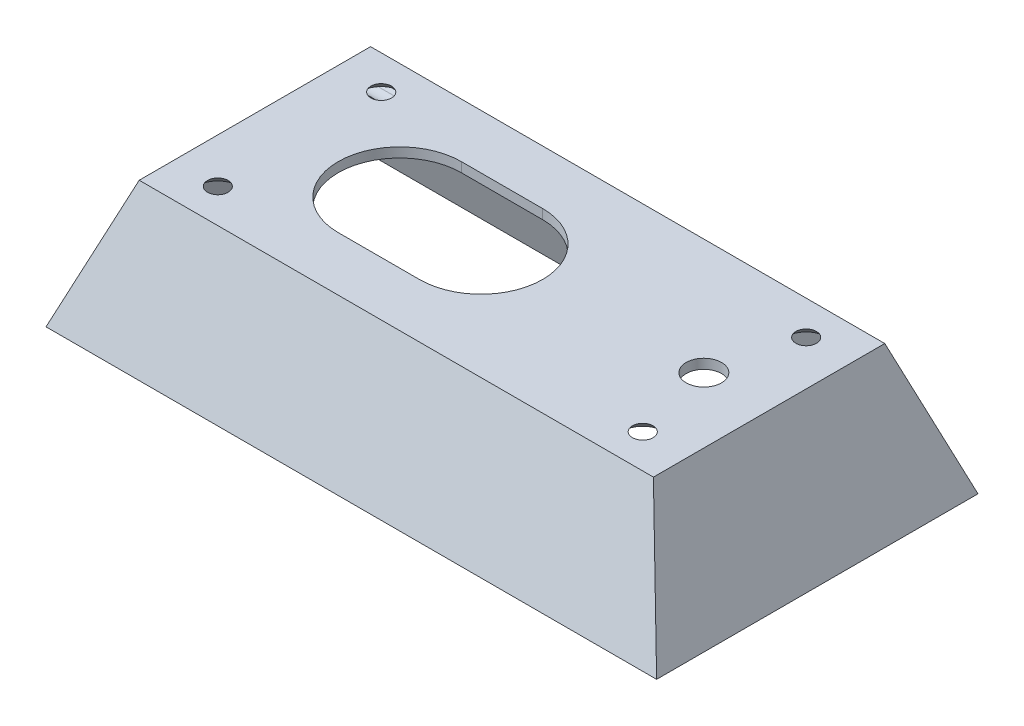
ISO-10303-21;
HEADER;
FILE_DESCRIPTION(('STEP AP214'),'2;1');
FILE_NAME('part.step','',(''),(''),'','','');
FILE_SCHEMA(('AUTOMOTIVE_DESIGN { 1 0 10303 214 1 1 1 1 }'));
ENDSEC;
DATA;
#1=APPLICATION_CONTEXT('core data for automotive mechanical design processes');
#2=APPLICATION_PROTOCOL_DEFINITION('international standard','automotive_design',2000,#1);
#3=PRODUCT_CONTEXT('',#1,'mechanical');
#4=PRODUCT('Part','Part','',(#3));
#5=PRODUCT_RELATED_PRODUCT_CATEGORY('part','',(#4));
#6=PRODUCT_DEFINITION_FORMATION('','',#4);
#7=PRODUCT_DEFINITION_CONTEXT('part definition',#1,'design');
#8=PRODUCT_DEFINITION('design','',#6,#7);
#9=PRODUCT_DEFINITION_SHAPE('','',#8);
#10=(LENGTH_UNIT() NAMED_UNIT(*) SI_UNIT(.MILLI.,.METRE.));
#11=(NAMED_UNIT(*) PLANE_ANGLE_UNIT() SI_UNIT($,.RADIAN.));
#12=(NAMED_UNIT(*) SI_UNIT($,.STERADIAN.) SOLID_ANGLE_UNIT());
#13=UNCERTAINTY_MEASURE_WITH_UNIT(LENGTH_MEASURE(1.E-05),#10,'distance_accuracy_value','');
#14=(GEOMETRIC_REPRESENTATION_CONTEXT(3) GLOBAL_UNCERTAINTY_ASSIGNED_CONTEXT((#13)) GLOBAL_UNIT_ASSIGNED_CONTEXT((#10,
#11,#12)) REPRESENTATION_CONTEXT('',''));
#15=CARTESIAN_POINT('',(0.,0.,0.));
#16=DIRECTION('',(0.,0.,1.));
#17=DIRECTION('',(1.,0.,0.));
#18=AXIS2_PLACEMENT_3D('',#15,#16,#17);
#19=CARTESIAN_POINT('',(0.,7.29957458562499,20.8559273875));
#20=DIRECTION('',(0.,0.330350424728106,0.943858356366017));
#21=DIRECTION('',(0.,-0.943858356366017,0.330350424728106));
#22=AXIS2_PLACEMENT_3D('',#19,#20,#21);
#23=PLANE('',#22);
#24=DIRECTION('',(1.,0.,0.));
#25=VECTOR('',#24,1.);
#26=CARTESIAN_POINT('',(-39.7391824417549,16.4235116159948,17.6625494268706));
#27=LINE('',#26,#25);
#28=CARTESIAN_POINT('',(-39.7391824417549,16.4235116159948,17.6625494268706));
#29=VERTEX_POINT('',#28);
#30=CARTESIAN_POINT('',(7.60528037208097,16.4235116159948,17.6625494268706));
#31=VERTEX_POINT('',#30);
#32=EDGE_CURVE('E203',#29,#31,#27,.T.);
#33=ORIENTED_EDGE('',*,*,#32,.F.);
#34=DIRECTION('',(-0.333663039975097,-0.889768106600258,0.311418837310091));
#35=VECTOR('',#34,1.);
#36=CARTESIAN_POINT('',(-38.3555384736991,20.1132288641436,16.3711483900184));
#37=LINE('',#36,#35);
#38=CARTESIAN_POINT('',(-38.960499297753,18.5,16.9357784924687));
#39=VERTEX_POINT('',#38);
#40=EDGE_CURVE('E224',#39,#29,#37,.T.);
#41=ORIENTED_EDGE('',*,*,#40,.F.);
#42=DIRECTION('',(1.,0.,0.));
#43=VECTOR('',#42,1.);
#44=CARTESIAN_POINT('',(0.,18.5,16.9357784924687));
#45=LINE('',#44,#43);
#46=CARTESIAN_POINT('',(38.960499297753,18.5,16.9357784924687));
#47=VERTEX_POINT('',#46);
#48=EDGE_CURVE('E241',#39,#47,#45,.T.);
#49=ORIENTED_EDGE('',*,*,#48,.T.);
#50=DIRECTION('',(0.333663039975097,-0.889768106600258,0.311418837310091));
#51=VECTOR('',#50,1.);
#52=CARTESIAN_POINT('',(38.3555384736991,20.1132288641436,16.3711483900184));
#53=LINE('',#52,#51);
#54=CARTESIAN_POINT('',(45.897999297753,0.,23.4107784924687));
#55=VERTEX_POINT('',#54);
#56=EDGE_CURVE('E234',#47,#55,#53,.T.);
#57=ORIENTED_EDGE('',*,*,#56,.T.);
#58=DIRECTION('',(1.,0.,0.));
#59=VECTOR('',#58,1.);
#60=CARTESIAN_POINT('',(0.,0.,23.4107784924687));
#61=LINE('',#60,#59);
#62=CARTESIAN_POINT('',(-45.897999297753,0.,23.4107784924687));
#63=VERTEX_POINT('',#62);
#64=EDGE_CURVE('E251',#63,#55,#61,.T.);
#65=ORIENTED_EDGE('',*,*,#64,.F.);
#66=CARTESIAN_POINT('',(-40.4470762090294,14.5357949032627,18.3232502763268));
#67=VERTEX_POINT('',#66);
#68=EDGE_CURVE('E235',#67,#63,#37,.T.);
#69=ORIENTED_EDGE('',*,*,#68,.F.);
#70=DIRECTION('',(-1.,0.,0.));
#71=VECTOR('',#70,1.);
#72=CARTESIAN_POINT('',(-40.4470762090294,14.5357949032627,18.3232502763268));
#73=LINE('',#72,#71);
#74=CARTESIAN_POINT('',(7.60528037208097,14.5357949032627,18.3232502763268));
#75=VERTEX_POINT('',#74);
#76=EDGE_CURVE('E567',#75,#67,#73,.T.);
#77=ORIENTED_EDGE('',*,*,#76,.F.);
#78=DIRECTION('',(0.,-0.943858356366017,0.330350424728107));
#79=VECTOR('',#78,1.);
#80=CARTESIAN_POINT('',(7.60528037208097,16.4235116159948,17.6625494268706));
#81=LINE('',#80,#79);
#82=EDGE_CURVE('E227',#31,#75,#81,.T.);
#83=ORIENTED_EDGE('',*,*,#82,.F.);
#84=EDGE_LOOP('',(#33,#41,#49,#57,#65,#69,#77,#83));
#85=FACE_BOUND('',#84,.T.);
#86=ADVANCED_FACE('F51',(#85),#23,.F.);
#87=CARTESIAN_POINT('',(0.,0.,0.));
#88=DIRECTION('',(0.,1.,0.));
#89=DIRECTION('',(0.,0.,1.));
#90=AXIS2_PLACEMENT_3D('',#87,#88,#89);
#91=PLANE('',#90);
#92=ORIENTED_EDGE('',*,*,#64,.T.);
#93=DIRECTION('',(0.,0.,-1.));
#94=VECTOR('',#93,1.);
#95=CARTESIAN_POINT('',(45.897999297753,0.,0.));
#96=LINE('',#95,#94);
#97=CARTESIAN_POINT('',(45.897999297753,0.,-23.4107784924687));
#98=VERTEX_POINT('',#97);
#99=EDGE_CURVE('E247',#55,#98,#96,.T.);
#100=ORIENTED_EDGE('',*,*,#99,.T.);
#101=DIRECTION('',(-1.,0.,0.));
#102=VECTOR('',#101,1.);
#103=CARTESIAN_POINT('',(0.,0.,-23.4107784924687));
#104=LINE('',#103,#102);
#105=CARTESIAN_POINT('',(-45.897999297753,0.,-23.4107784924687));
#106=VERTEX_POINT('',#105);
#107=EDGE_CURVE('E257',#98,#106,#104,.T.);
#108=ORIENTED_EDGE('',*,*,#107,.T.);
#109=DIRECTION('',(0.,0.,1.));
#110=VECTOR('',#109,1.);
#111=CARTESIAN_POINT('',(-45.897999297753,0.,0.));
#112=LINE('',#111,#110);
#113=EDGE_CURVE('E254',#106,#63,#112,.T.);
#114=ORIENTED_EDGE('',*,*,#113,.T.);
#115=EDGE_LOOP('',(#92,#100,#108,#114));
#116=FACE_BOUND('',#115,.T.);
#117=DIRECTION('',(0.,0.,-1.));
#118=VECTOR('',#117,1.);
#119=CARTESIAN_POINT('',(47.5,0.,-25.));
#120=LINE('',#119,#118);
#121=CARTESIAN_POINT('',(47.5,0.,25.));
#122=VERTEX_POINT('',#121);
#123=CARTESIAN_POINT('',(47.5,0.,-25.));
#124=VERTEX_POINT('',#123);
#125=EDGE_CURVE('E311',#122,#124,#120,.T.);
#126=ORIENTED_EDGE('',*,*,#125,.F.);
#127=DIRECTION('',(1.,0.,0.));
#128=VECTOR('',#127,1.);
#129=CARTESIAN_POINT('',(-47.5,0.,25.));
#130=LINE('',#129,#128);
#131=CARTESIAN_POINT('',(-47.5,0.,25.));
#132=VERTEX_POINT('',#131);
#133=EDGE_CURVE('E383',#132,#122,#130,.T.);
#134=ORIENTED_EDGE('',*,*,#133,.F.);
#135=DIRECTION('',(0.,0.,1.));
#136=VECTOR('',#135,1.);
#137=CARTESIAN_POINT('',(-47.5,0.,-25.));
#138=LINE('',#137,#136);
#139=CARTESIAN_POINT('',(-47.5,0.,-25.));
#140=VERTEX_POINT('',#139);
#141=EDGE_CURVE('E385',#140,#132,#138,.T.);
#142=ORIENTED_EDGE('',*,*,#141,.F.);
#143=DIRECTION('',(-1.,0.,0.));
#144=VECTOR('',#143,1.);
#145=CARTESIAN_POINT('',(-47.5,0.,-25.));
#146=LINE('',#145,#144);
#147=EDGE_CURVE('E378',#124,#140,#146,.T.);
#148=ORIENTED_EDGE('',*,*,#147,.F.);
#149=EDGE_LOOP('',(#126,#134,#142,#148));
#150=FACE_BOUND('',#149,.T.);
#151=ADVANCED_FACE('F290',(#116,#150),#91,.F.);
#152=CARTESIAN_POINT('',(0.,20.,0.));
#153=DIRECTION('',(0.,1.,0.));
#154=DIRECTION('',(0.,0.,1.));
#155=AXIS2_PLACEMENT_3D('',#152,#153,#154);
#156=PLANE('',#155);
#157=CARTESIAN_POINT('',(33.0576726488888,20.,-12.7118055800183));
#158=DIRECTION('',(0.,1.,0.));
#159=DIRECTION('',(0.,0.,1.));
#160=AXIS2_PLACEMENT_3D('',#157,#158,#159);
#161=CIRCLE('',#160,1.60355303137907);
#162=CARTESIAN_POINT('',(33.0576726488888,20.,-11.1082525486392));
#163=VERTEX_POINT('',#162);
#164=EDGE_CURVE('E12',#163,#163,#161,.F.);
#165=ORIENTED_EDGE('',*,*,#164,.T.);
#166=EDGE_LOOP('',(#165));
#167=FACE_BOUND('',#166,.T.);
#168=CARTESIAN_POINT('',(-33.0576726488888,20.,-12.7118055800183));
#169=DIRECTION('',(0.,1.,0.));
#170=DIRECTION('',(0.,0.,1.));
#171=AXIS2_PLACEMENT_3D('',#168,#169,#170);
#172=CIRCLE('',#171,1.60355303137907);
#173=CARTESIAN_POINT('',(-33.0576726488888,20.,-11.1082525486392));
#174=VERTEX_POINT('',#173);
#175=EDGE_CURVE('E60',#174,#174,#172,.F.);
#176=ORIENTED_EDGE('',*,*,#175,.T.);
#177=EDGE_LOOP('',(#176));
#178=FACE_BOUND('',#177,.T.);
#179=CARTESIAN_POINT('',(33.0576726488888,20.,12.7118055800183));
#180=DIRECTION('',(0.,1.,0.));
#181=DIRECTION('',(0.,0.,1.));
#182=AXIS2_PLACEMENT_3D('',#179,#180,#181);
#183=CIRCLE('',#182,1.60355303137907);
#184=CARTESIAN_POINT('',(33.0576726488888,20.,14.3153586113973));
#185=VERTEX_POINT('',#184);
#186=EDGE_CURVE('E484',#185,#185,#183,.F.);
#187=ORIENTED_EDGE('',*,*,#186,.T.);
#188=EDGE_LOOP('',(#187));
#189=FACE_BOUND('',#188,.T.);
#190=CARTESIAN_POINT('',(-33.0576726488888,20.,12.7118055800183));
#191=DIRECTION('',(0.,1.,0.));
#192=DIRECTION('',(0.,0.,1.));
#193=AXIS2_PLACEMENT_3D('',#190,#191,#192);
#194=CIRCLE('',#193,1.60355303137907);
#195=CARTESIAN_POINT('',(-33.0576726488888,20.,14.3153586113973));
#196=VERTEX_POINT('',#195);
#197=EDGE_CURVE('E481',#196,#196,#194,.F.);
#198=ORIENTED_EDGE('',*,*,#197,.T.);
#199=EDGE_LOOP('',(#198));
#200=FACE_BOUND('',#199,.T.);
#201=CARTESIAN_POINT('',(29.8501847985942,20.,0.));
#202=DIRECTION('',(0.,1.,0.));
#203=DIRECTION('',(0.,0.,1.));
#204=AXIS2_PLACEMENT_3D('',#201,#202,#203);
#205=CIRCLE('',#204,2.75);
#206=CARTESIAN_POINT('',(29.8501847985942,20.,2.75));
#207=VERTEX_POINT('',#206);
#208=EDGE_CURVE('E469',#207,#207,#205,.T.);
#209=ORIENTED_EDGE('',*,*,#208,.F.);
#210=EDGE_LOOP('',(#209));
#211=FACE_BOUND('',#210,.T.);
#212=CARTESIAN_POINT('',(-17.4597803829499,20.,0.));
#213=DIRECTION('',(0.,1.,0.));
#214=DIRECTION('',(0.,0.,1.));
#215=AXIS2_PLACEMENT_3D('',#212,#213,#214);
#216=CIRCLE('',#215,9.57262281789639);
#217=CARTESIAN_POINT('',(-17.4597803829499,20.,-9.57262281789639));
#218=VERTEX_POINT('',#217);
#219=CARTESIAN_POINT('',(-17.4597803829499,20.,9.57262281789639));
#220=VERTEX_POINT('',#219);
#221=EDGE_CURVE('E542',#218,#220,#216,.T.);
#222=ORIENTED_EDGE('',*,*,#221,.F.);
#223=DIRECTION('',(-1.,0.,0.));
#224=VECTOR('',#223,1.);
#225=CARTESIAN_POINT('',(-17.4597803829499,20.,-9.57262281789639));
#226=LINE('',#225,#224);
#227=CARTESIAN_POINT('',(-4.81483557911311,20.,-9.57262281789639));
#228=VERTEX_POINT('',#227);
#229=EDGE_CURVE('E529',#228,#218,#226,.T.);
#230=ORIENTED_EDGE('',*,*,#229,.F.);
#231=CARTESIAN_POINT('',(-4.81483557911311,20.,0.));
#232=DIRECTION('',(0.,1.,0.));
#233=DIRECTION('',(0.,0.,1.));
#234=AXIS2_PLACEMENT_3D('',#231,#232,#233);
#235=CIRCLE('',#234,9.57262281789639);
#236=CARTESIAN_POINT('',(-4.81483557911311,20.,9.57262281789639));
#237=VERTEX_POINT('',#236);
#238=EDGE_CURVE('E536',#237,#228,#235,.T.);
#239=ORIENTED_EDGE('',*,*,#238,.F.);
#240=DIRECTION('',(1.,0.,0.));
#241=VECTOR('',#240,1.);
#242=CARTESIAN_POINT('',(-17.4597803829499,20.,9.57262281789639));
#243=LINE('',#242,#241);
#244=EDGE_CURVE('E539',#220,#237,#243,.T.);
#245=ORIENTED_EDGE('',*,*,#244,.F.);
#246=EDGE_LOOP('',(#222,#230,#239,#245));
#247=FACE_BOUND('',#246,.T.);
#248=DIRECTION('',(0.,0.,-1.));
#249=VECTOR('',#248,1.);
#250=CARTESIAN_POINT('',(40.,20.,-18.));
#251=LINE('',#250,#249);
#252=CARTESIAN_POINT('',(40.,20.,18.));
#253=VERTEX_POINT('',#252);
#254=CARTESIAN_POINT('',(40.,20.,-18.));
#255=VERTEX_POINT('',#254);
#256=EDGE_CURVE('E260',#253,#255,#251,.T.);
#257=ORIENTED_EDGE('',*,*,#256,.T.);
#258=DIRECTION('',(-1.,0.,0.));
#259=VECTOR('',#258,1.);
#260=CARTESIAN_POINT('',(-40.,20.,-18.));
#261=LINE('',#260,#259);
#262=CARTESIAN_POINT('',(-40.,20.,-18.));
#263=VERTEX_POINT('',#262);
#264=EDGE_CURVE('E268',#255,#263,#261,.T.);
#265=ORIENTED_EDGE('',*,*,#264,.T.);
#266=DIRECTION('',(0.,0.,1.));
#267=VECTOR('',#266,1.);
#268=CARTESIAN_POINT('',(-40.,20.,-18.));
#269=LINE('',#268,#267);
#270=CARTESIAN_POINT('',(-40.,20.,18.));
#271=VERTEX_POINT('',#270);
#272=EDGE_CURVE('E367',#263,#271,#269,.T.);
#273=ORIENTED_EDGE('',*,*,#272,.T.);
#274=DIRECTION('',(1.,0.,0.));
#275=VECTOR('',#274,1.);
#276=CARTESIAN_POINT('',(-40.,20.,18.));
#277=LINE('',#276,#275);
#278=EDGE_CURVE('E352',#271,#253,#277,.T.);
#279=ORIENTED_EDGE('',*,*,#278,.T.);
#280=EDGE_LOOP('',(#257,#265,#273,#279));
#281=FACE_BOUND('',#280,.T.);
#282=ADVANCED_FACE('F489',(#167,#178,#189,#200,#211,#247,#281),#156,.T.);
#283=CARTESIAN_POINT('',(0.,7.79510022271715,22.271714922049));
#284=DIRECTION('',(0.,0.330350424728106,0.943858356366017));
#285=DIRECTION('',(0.,-0.943858356366017,0.330350424728106));
#286=AXIS2_PLACEMENT_3D('',#283,#284,#285);
#287=PLANE('',#286);
#288=DIRECTION('',(-0.333663039975097,-0.889768106600258,0.311418837310091));
#289=VECTOR('',#288,1.);
#290=CARTESIAN_POINT('',(-40.,20.,18.));
#291=LINE('',#290,#289);
#292=EDGE_CURVE('E344',#271,#132,#291,.T.);
#293=ORIENTED_EDGE('',*,*,#292,.T.);
#294=ORIENTED_EDGE('',*,*,#133,.T.);
#295=DIRECTION('',(0.333663039975097,-0.889768106600258,0.311418837310091));
#296=VECTOR('',#295,1.);
#297=CARTESIAN_POINT('',(40.,20.,18.));
#298=LINE('',#297,#296);
#299=EDGE_CURVE('E336',#253,#122,#298,.T.);
#300=ORIENTED_EDGE('',*,*,#299,.F.);
#301=ORIENTED_EDGE('',*,*,#278,.F.);
#302=EDGE_LOOP('',(#293,#294,#300,#301));
#303=FACE_BOUND('',#302,.T.);
#304=ADVANCED_FACE('F325',(#303),#287,.T.);
#305=CARTESIAN_POINT('',(41.6438356164384,15.6164383561644,0.));
#306=DIRECTION('',(0.936329177569045,0.351123441588392,0.));
#307=DIRECTION('',(-0.351123441588392,0.936329177569045,0.));
#308=AXIS2_PLACEMENT_3D('',#305,#306,#307);
#309=PLANE('',#308);
#310=ORIENTED_EDGE('',*,*,#299,.T.);
#311=ORIENTED_EDGE('',*,*,#125,.T.);
#312=DIRECTION('',(0.333663039975097,-0.889768106600258,-0.31141883731009));
#313=VECTOR('',#312,1.);
#314=CARTESIAN_POINT('',(40.,20.,-18.));
#315=LINE('',#314,#313);
#316=EDGE_CURVE('E274',#255,#124,#315,.T.);
#317=ORIENTED_EDGE('',*,*,#316,.F.);
#318=ORIENTED_EDGE('',*,*,#256,.F.);
#319=EDGE_LOOP('',(#310,#311,#317,#318));
#320=FACE_BOUND('',#319,.T.);
#321=ADVANCED_FACE('F316',(#320),#309,.T.);
#322=CARTESIAN_POINT('',(-41.6438356164384,15.6164383561644,0.));
#323=DIRECTION('',(-0.936329177569045,0.351123441588392,0.));
#324=DIRECTION('',(-0.351123441588392,-0.936329177569045,0.));
#325=AXIS2_PLACEMENT_3D('',#322,#323,#324);
#326=PLANE('',#325);
#327=DIRECTION('',(-0.333663039975097,-0.889768106600258,-0.31141883731009));
#328=VECTOR('',#327,1.);
#329=CARTESIAN_POINT('',(-40.,20.,-18.));
#330=LINE('',#329,#328);
#331=EDGE_CURVE('E343',#263,#140,#330,.T.);
#332=ORIENTED_EDGE('',*,*,#331,.T.);
#333=ORIENTED_EDGE('',*,*,#141,.T.);
#334=ORIENTED_EDGE('',*,*,#292,.F.);
#335=ORIENTED_EDGE('',*,*,#272,.F.);
#336=EDGE_LOOP('',(#332,#333,#334,#335));
#337=FACE_BOUND('',#336,.T.);
#338=ADVANCED_FACE('F287',(#337),#326,.T.);
#339=CARTESIAN_POINT('',(0.,7.79510022271715,-22.271714922049));
#340=DIRECTION('',(0.,0.330350424728106,-0.943858356366018));
#341=DIRECTION('',(0.,0.943858356366018,0.330350424728106));
#342=AXIS2_PLACEMENT_3D('',#339,#340,#341);
#343=PLANE('',#342);
#344=ORIENTED_EDGE('',*,*,#316,.T.);
#345=ORIENTED_EDGE('',*,*,#147,.T.);
#346=ORIENTED_EDGE('',*,*,#331,.F.);
#347=ORIENTED_EDGE('',*,*,#264,.F.);
#348=EDGE_LOOP('',(#344,#345,#346,#347));
#349=FACE_BOUND('',#348,.T.);
#350=ADVANCED_FACE('F276',(#349),#343,.T.);
#351=CARTESIAN_POINT('',(0.,18.5,0.));
#352=DIRECTION('',(0.,1.,0.));
#353=DIRECTION('',(0.,0.,1.));
#354=AXIS2_PLACEMENT_3D('',#351,#352,#353);
#355=PLANE('',#354);
#356=CARTESIAN_POINT('',(33.0576726488888,18.5,-12.7118055800183));
#357=DIRECTION('',(0.,1.,0.));
#358=DIRECTION('',(0.,0.,1.));
#359=AXIS2_PLACEMENT_3D('',#356,#357,#358);
#360=CIRCLE('',#359,3.15684850206494);
#361=CARTESIAN_POINT('',(33.0576726488888,18.5,-9.55495707795333));
#362=VERTEX_POINT('',#361);
#363=EDGE_CURVE('E478',#362,#362,#360,.T.);
#364=ORIENTED_EDGE('',*,*,#363,.T.);
#365=EDGE_LOOP('',(#364));
#366=FACE_BOUND('',#365,.T.);
#367=CARTESIAN_POINT('',(-33.0576726488888,18.5,-12.7118055800183));
#368=DIRECTION('',(0.,1.,0.));
#369=DIRECTION('',(0.,0.,1.));
#370=AXIS2_PLACEMENT_3D('',#367,#368,#369);
#371=CIRCLE('',#370,3.15684850206494);
#372=CARTESIAN_POINT('',(-33.0576726488888,18.5,-9.55495707795333));
#373=VERTEX_POINT('',#372);
#374=EDGE_CURVE('E475',#373,#373,#371,.T.);
#375=ORIENTED_EDGE('',*,*,#374,.T.);
#376=EDGE_LOOP('',(#375));
#377=FACE_BOUND('',#376,.T.);
#378=CARTESIAN_POINT('',(33.0576726488888,18.5,12.7118055800183));
#379=DIRECTION('',(0.,1.,0.));
#380=DIRECTION('',(0.,0.,1.));
#381=AXIS2_PLACEMENT_3D('',#378,#379,#380);
#382=CIRCLE('',#381,3.15684850206494);
#383=CARTESIAN_POINT('',(33.0576726488888,18.5,15.8686540820832));
#384=VERTEX_POINT('',#383);
#385=EDGE_CURVE('E472',#384,#384,#382,.T.);
#386=ORIENTED_EDGE('',*,*,#385,.T.);
#387=EDGE_LOOP('',(#386));
#388=FACE_BOUND('',#387,.T.);
#389=CARTESIAN_POINT('',(-33.0576726488888,18.5,12.7118055800183));
#390=DIRECTION('',(0.,1.,0.));
#391=DIRECTION('',(0.,0.,1.));
#392=AXIS2_PLACEMENT_3D('',#389,#390,#391);
#393=CIRCLE('',#392,3.15684850206494);
#394=CARTESIAN_POINT('',(-33.0576726488888,18.5,15.8686540820832));
#395=VERTEX_POINT('',#394);
#396=EDGE_CURVE('E463',#395,#395,#393,.T.);
#397=ORIENTED_EDGE('',*,*,#396,.T.);
#398=EDGE_LOOP('',(#397));
#399=FACE_BOUND('',#398,.T.);
#400=CARTESIAN_POINT('',(29.8501847985942,18.5,0.));
#401=DIRECTION('',(0.,1.,0.));
#402=DIRECTION('',(0.,0.,1.));
#403=AXIS2_PLACEMENT_3D('',#400,#401,#402);
#404=CIRCLE('',#403,2.75);
#405=CARTESIAN_POINT('',(29.8501847985942,18.5,2.75));
#406=VERTEX_POINT('',#405);
#407=EDGE_CURVE('E466',#406,#406,#404,.T.);
#408=ORIENTED_EDGE('',*,*,#407,.T.);
#409=EDGE_LOOP('',(#408));
#410=FACE_BOUND('',#409,.T.);
#411=DIRECTION('',(-1.,0.,0.));
#412=VECTOR('',#411,1.);
#413=CARTESIAN_POINT('',(0.,18.5,-9.57262281789639));
#414=LINE('',#413,#412);
#415=CARTESIAN_POINT('',(-4.81483557911311,18.5,-9.57262281789639));
#416=VERTEX_POINT('',#415);
#417=CARTESIAN_POINT('',(-17.4597803829499,18.5,-9.57262281789639));
#418=VERTEX_POINT('',#417);
#419=EDGE_CURVE('E431',#416,#418,#414,.T.);
#420=ORIENTED_EDGE('',*,*,#419,.T.);
#421=CARTESIAN_POINT('',(-17.4597803829499,18.5,0.));
#422=DIRECTION('',(0.,1.,0.));
#423=DIRECTION('',(0.,0.,1.));
#424=AXIS2_PLACEMENT_3D('',#421,#422,#423);
#425=CIRCLE('',#424,9.57262281789639);
#426=CARTESIAN_POINT('',(-17.4597803829499,18.5,9.57262281789639));
#427=VERTEX_POINT('',#426);
#428=EDGE_CURVE('E434',#418,#427,#425,.T.);
#429=ORIENTED_EDGE('',*,*,#428,.T.);
#430=DIRECTION('',(1.,0.,0.));
#431=VECTOR('',#430,1.);
#432=CARTESIAN_POINT('',(0.,18.5,9.57262281789639));
#433=LINE('',#432,#431);
#434=CARTESIAN_POINT('',(-4.81483557911311,18.5,9.57262281789639));
#435=VERTEX_POINT('',#434);
#436=EDGE_CURVE('E396',#427,#435,#433,.T.);
#437=ORIENTED_EDGE('',*,*,#436,.T.);
#438=CARTESIAN_POINT('',(-4.81483557911311,18.5,0.));
#439=DIRECTION('',(0.,1.,0.));
#440=DIRECTION('',(0.,0.,1.));
#441=AXIS2_PLACEMENT_3D('',#438,#439,#440);
#442=CIRCLE('',#441,9.57262281789639);
#443=EDGE_CURVE('E428',#435,#416,#442,.T.);
#444=ORIENTED_EDGE('',*,*,#443,.T.);
#445=EDGE_LOOP('',(#420,#429,#437,#444));
#446=FACE_BOUND('',#445,.T.);
#447=DIRECTION('',(0.,0.,-1.));
#448=VECTOR('',#447,1.);
#449=CARTESIAN_POINT('',(38.960499297753,18.5,0.));
#450=LINE('',#449,#448);
#451=CARTESIAN_POINT('',(38.960499297753,18.5,-16.9357784924687));
#452=VERTEX_POINT('',#451);
#453=EDGE_CURVE('E515',#47,#452,#450,.T.);
#454=ORIENTED_EDGE('',*,*,#453,.F.);
#455=ORIENTED_EDGE('',*,*,#48,.F.);
#456=DIRECTION('',(0.,0.,1.));
#457=VECTOR('',#456,1.);
#458=CARTESIAN_POINT('',(-38.960499297753,18.5,0.));
#459=LINE('',#458,#457);
#460=CARTESIAN_POINT('',(-38.960499297753,18.5,-16.9357784924687));
#461=VERTEX_POINT('',#460);
#462=EDGE_CURVE('E232',#461,#39,#459,.T.);
#463=ORIENTED_EDGE('',*,*,#462,.F.);
#464=DIRECTION('',(-1.,0.,0.));
#465=VECTOR('',#464,1.);
#466=CARTESIAN_POINT('',(0.,18.5,-16.9357784924687));
#467=LINE('',#466,#465);
#468=EDGE_CURVE('E239',#452,#461,#467,.T.);
#469=ORIENTED_EDGE('',*,*,#468,.F.);
#470=EDGE_LOOP('',(#454,#455,#463,#469));
#471=FACE_BOUND('',#470,.T.);
#472=ADVANCED_FACE('F286',(#366,#377,#388,#399,#410,#446,#471),#355,.F.);
#473=CARTESIAN_POINT('',(40.2393418500848,15.0897531937818,0.));
#474=DIRECTION('',(0.936329177569045,0.351123441588392,0.));
#475=DIRECTION('',(-0.351123441588392,0.936329177569045,0.));
#476=AXIS2_PLACEMENT_3D('',#473,#474,#475);
#477=PLANE('',#476);
#478=ORIENTED_EDGE('',*,*,#56,.F.);
#479=ORIENTED_EDGE('',*,*,#453,.T.);
#480=DIRECTION('',(0.333663039975097,-0.889768106600258,-0.31141883731009));
#481=VECTOR('',#480,1.);
#482=CARTESIAN_POINT('',(38.3555384736991,20.1132288641436,-16.3711483900185));
#483=LINE('',#482,#481);
#484=EDGE_CURVE('E244',#452,#98,#483,.T.);
#485=ORIENTED_EDGE('',*,*,#484,.T.);
#486=ORIENTED_EDGE('',*,*,#99,.F.);
#487=EDGE_LOOP('',(#478,#479,#485,#486));
#488=FACE_BOUND('',#487,.T.);
#489=ADVANCED_FACE('F502',(#488),#477,.F.);
#490=CARTESIAN_POINT('',(-40.2393418500848,15.0897531937818,0.));
#491=DIRECTION('',(-0.936329177569045,0.351123441588392,0.));
#492=DIRECTION('',(-0.351123441588392,-0.936329177569045,0.));
#493=AXIS2_PLACEMENT_3D('',#490,#491,#492);
#494=PLANE('',#493);
#495=DIRECTION('',(-0.333663039975097,-0.889768106600258,-0.31141883731009));
#496=VECTOR('',#495,1.);
#497=CARTESIAN_POINT('',(-38.3555384736991,20.1132288641436,-16.3711483900185));
#498=LINE('',#497,#496);
#499=CARTESIAN_POINT('',(-39.7391824417549,16.4235116159948,-17.6625494268706));
#500=VERTEX_POINT('',#499);
#501=EDGE_CURVE('E248',#461,#500,#498,.T.);
#502=ORIENTED_EDGE('',*,*,#501,.F.);
#503=ORIENTED_EDGE('',*,*,#462,.T.);
#504=ORIENTED_EDGE('',*,*,#40,.T.);
#505=DIRECTION('',(0.333663039975098,0.889768106600258,-0.31141883731009));
#506=VECTOR('',#505,1.);
#507=CARTESIAN_POINT('',(-39.7391824417549,16.4235116159948,17.6625494268706));
#508=LINE('',#507,#506);
#509=EDGE_CURVE('E213',#67,#29,#508,.T.);
#510=ORIENTED_EDGE('',*,*,#509,.F.);
#511=ORIENTED_EDGE('',*,*,#68,.T.);
#512=ORIENTED_EDGE('',*,*,#113,.F.);
#513=CARTESIAN_POINT('',(-40.2701027672108,15.0077240814457,-18.1580750639627));
#514=VERTEX_POINT('',#513);
#515=EDGE_CURVE('E237',#514,#106,#498,.T.);
#516=ORIENTED_EDGE('',*,*,#515,.F.);
#517=DIRECTION('',(-0.333663039975097,-0.889768106600258,-0.31141883731009));
#518=VECTOR('',#517,1.);
#519=CARTESIAN_POINT('',(-38.3555384736991,20.1132288641436,-16.3711483900185));
#520=LINE('',#519,#518);
#521=EDGE_CURVE('E555',#500,#514,#520,.T.);
#522=ORIENTED_EDGE('',*,*,#521,.F.);
#523=EDGE_LOOP('',(#502,#503,#504,#510,#511,#512,#516,#522));
#524=FACE_BOUND('',#523,.T.);
#525=ADVANCED_FACE('F230',(#524),#494,.F.);
#526=CARTESIAN_POINT('',(0.,7.29957458562499,-20.8559273875));
#527=DIRECTION('',(0.,0.330350424728106,-0.943858356366018));
#528=DIRECTION('',(0.,0.943858356366018,0.330350424728106));
#529=AXIS2_PLACEMENT_3D('',#526,#527,#528);
#530=PLANE('',#529);
#531=ORIENTED_EDGE('',*,*,#501,.T.);
#532=DIRECTION('',(1.,0.,0.));
#533=VECTOR('',#532,1.);
#534=CARTESIAN_POINT('',(0.,16.4235116159948,-17.6625494268706));
#535=LINE('',#534,#533);
#536=CARTESIAN_POINT('',(-21.1173074973221,16.4235116159948,-17.6625494268706));
#537=VERTEX_POINT('',#536);
#538=EDGE_CURVE('E558',#500,#537,#535,.T.);
#539=ORIENTED_EDGE('',*,*,#538,.T.);
#540=DIRECTION('',(0.,-0.943858356366018,-0.330350424728106));
#541=VECTOR('',#540,1.);
#542=CARTESIAN_POINT('',(-21.1173074973221,7.299574585625,-20.8559273875));
#543=LINE('',#542,#541);
#544=CARTESIAN_POINT('',(-21.1173074973221,15.0077240814457,-18.1580750639627));
#545=VERTEX_POINT('',#544);
#546=EDGE_CURVE('E453',#537,#545,#543,.T.);
#547=ORIENTED_EDGE('',*,*,#546,.T.);
#548=DIRECTION('',(1.,0.,0.));
#549=VECTOR('',#548,1.);
#550=CARTESIAN_POINT('',(0.,15.0077240814457,-18.1580750639627));
#551=LINE('',#550,#549);
#552=EDGE_CURVE('E552',#514,#545,#551,.T.);
#553=ORIENTED_EDGE('',*,*,#552,.F.);
#554=ORIENTED_EDGE('',*,*,#515,.T.);
#555=ORIENTED_EDGE('',*,*,#107,.F.);
#556=ORIENTED_EDGE('',*,*,#484,.F.);
#557=ORIENTED_EDGE('',*,*,#468,.T.);
#558=EDGE_LOOP('',(#531,#539,#547,#553,#554,#555,#556,#557));
#559=FACE_BOUND('',#558,.T.);
#560=ADVANCED_FACE('F781',(#559),#530,.F.);
#561=CARTESIAN_POINT('',(-17.4597803829499,18.,0.));
#562=DIRECTION('',(0.,1.,0.));
#563=DIRECTION('',(0.,0.,1.));
#564=AXIS2_PLACEMENT_3D('',#561,#562,#563);
#565=CYLINDRICAL_SURFACE('',#564,9.57262281789639);
#566=DIRECTION('',(0.,1.,0.));
#567=VECTOR('',#566,1.);
#568=CARTESIAN_POINT('',(-17.4597803829499,18.,-9.57262281789639));
#569=LINE('',#568,#567);
#570=EDGE_CURVE('E518',#418,#218,#569,.T.);
#571=ORIENTED_EDGE('',*,*,#570,.T.);
#572=ORIENTED_EDGE('',*,*,#221,.T.);
#573=DIRECTION('',(0.,1.,0.));
#574=VECTOR('',#573,1.);
#575=CARTESIAN_POINT('',(-17.4597803829499,18.,9.57262281789639));
#576=LINE('',#575,#574);
#577=EDGE_CURVE('E525',#427,#220,#576,.T.);
#578=ORIENTED_EDGE('',*,*,#577,.F.);
#579=ORIENTED_EDGE('',*,*,#428,.F.);
#580=EDGE_LOOP('',(#571,#572,#578,#579));
#581=FACE_BOUND('',#580,.T.);
#582=ADVANCED_FACE('F861',(#581),#565,.F.);
#583=CARTESIAN_POINT('',(-17.4597803829499,18.,-9.57262281789639));
#584=DIRECTION('',(0.,0.,-1.));
#585=DIRECTION('',(-1.,0.,0.));
#586=AXIS2_PLACEMENT_3D('',#583,#584,#585);
#587=PLANE('',#586);
#588=DIRECTION('',(0.,1.,0.));
#589=VECTOR('',#588,1.);
#590=CARTESIAN_POINT('',(-4.81483557911311,18.,-9.57262281789639));
#591=LINE('',#590,#589);
#592=EDGE_CURVE('E531',#416,#228,#591,.T.);
#593=ORIENTED_EDGE('',*,*,#592,.T.);
#594=ORIENTED_EDGE('',*,*,#229,.T.);
#595=ORIENTED_EDGE('',*,*,#570,.F.);
#596=ORIENTED_EDGE('',*,*,#419,.F.);
#597=EDGE_LOOP('',(#593,#594,#595,#596));
#598=FACE_BOUND('',#597,.T.);
#599=ADVANCED_FACE('F883',(#598),#587,.F.);
#600=CARTESIAN_POINT('',(-4.81483557911311,18.,0.));
#601=DIRECTION('',(0.,1.,0.));
#602=DIRECTION('',(0.,0.,1.));
#603=AXIS2_PLACEMENT_3D('',#600,#601,#602);
#604=CYLINDRICAL_SURFACE('',#603,9.57262281789639);
#605=DIRECTION('',(0.,1.,0.));
#606=VECTOR('',#605,1.);
#607=CARTESIAN_POINT('',(-4.81483557911311,18.,9.57262281789639));
#608=LINE('',#607,#606);
#609=EDGE_CURVE('E528',#435,#237,#608,.T.);
#610=ORIENTED_EDGE('',*,*,#609,.T.);
#611=ORIENTED_EDGE('',*,*,#238,.T.);
#612=ORIENTED_EDGE('',*,*,#592,.F.);
#613=ORIENTED_EDGE('',*,*,#443,.F.);
#614=EDGE_LOOP('',(#610,#611,#612,#613));
#615=FACE_BOUND('',#614,.T.);
#616=ADVANCED_FACE('F872',(#615),#604,.F.);
#617=CARTESIAN_POINT('',(-17.4597803829499,18.,9.57262281789639));
#618=DIRECTION('',(0.,0.,1.));
#619=DIRECTION('',(1.,0.,0.));
#620=AXIS2_PLACEMENT_3D('',#617,#618,#619);
#621=PLANE('',#620);
#622=ORIENTED_EDGE('',*,*,#577,.T.);
#623=ORIENTED_EDGE('',*,*,#244,.T.);
#624=ORIENTED_EDGE('',*,*,#609,.F.);
#625=ORIENTED_EDGE('',*,*,#436,.F.);
#626=EDGE_LOOP('',(#622,#623,#624,#625));
#627=FACE_BOUND('',#626,.T.);
#628=ADVANCED_FACE('F850',(#627),#621,.F.);
#629=CARTESIAN_POINT('',(-21.1173074973221,6.63887373616879,-18.968210674768));
#630=DIRECTION('',(1.,0.,0.));
#631=DIRECTION('',(0.,0.,-1.));
#632=AXIS2_PLACEMENT_3D('',#629,#630,#631);
#633=PLANE('',#632);
#634=CARTESIAN_POINT('',(-21.1173074973221,14.9652504554093,-17.4313041295609));
#635=DIRECTION('',(1.,0.,0.));
#636=DIRECTION('',(0.,0.,-1.));
#637=AXIS2_PLACEMENT_3D('',#634,#635,#636);
#638=CIRCLE('',#637,1.3);
#639=CARTESIAN_POINT('',(-21.1173074973221,16.1922663186851,-17.0018485774144));
#640=VERTEX_POINT('',#639);
#641=CARTESIAN_POINT('',(-21.1173074973221,15.0952455517996,-16.1378199685004));
#642=VERTEX_POINT('',#641);
#643=EDGE_CURVE('E437',#640,#642,#638,.T.);
#644=ORIENTED_EDGE('',*,*,#643,.T.);
#645=CARTESIAN_POINT('',(-21.1173074973221,16.0034946474119,-17.06791866236));
#646=DIRECTION('',(1.,0.,0.));
#647=DIRECTION('',(0.,0.,-1.));
#648=AXIS2_PLACEMENT_3D('',#645,#646,#647);
#649=CIRCLE('',#648,1.3);
#650=CARTESIAN_POINT('',(-21.1173074973221,14.7764787841361,-17.4973742145065));
#651=VERTEX_POINT('',#650);
#652=EDGE_CURVE('E439',#642,#651,#649,.T.);
#653=ORIENTED_EDGE('',*,*,#652,.T.);
#654=DIRECTION('',(0.,0.330350424728106,-0.943858356366017));
#655=VECTOR('',#654,1.);
#656=CARTESIAN_POINT('',(-21.1173074973221,14.3470232319895,-16.2703583512307));
#657=LINE('',#656,#655);
#658=EDGE_CURVE('E550',#651,#545,#657,.T.);
#659=ORIENTED_EDGE('',*,*,#658,.T.);
#660=ORIENTED_EDGE('',*,*,#546,.F.);
#661=DIRECTION('',(0.,0.330350424728106,-0.943858356366017));
#662=VECTOR('',#661,1.);
#663=CARTESIAN_POINT('',(-21.1173074973221,15.7628107665386,-15.7748327141385));
#664=LINE('',#663,#662);
#665=EDGE_CURVE('E544',#640,#537,#664,.T.);
#666=ORIENTED_EDGE('',*,*,#665,.F.);
#667=EDGE_LOOP('',(#644,#653,#659,#660,#666));
#668=FACE_BOUND('',#667,.T.);
#669=ADVANCED_FACE('F838',(#668),#633,.T.);
#670=CARTESIAN_POINT('',(0.,15.7628107665386,-15.7748327141385));
#671=DIRECTION('',(0.,0.943858356366017,0.330350424728106));
#672=DIRECTION('',(0.,-0.330350424728106,0.943858356366018));
#673=AXIS2_PLACEMENT_3D('',#670,#671,#672);
#674=PLANE('',#673);
#675=DIRECTION('',(0.,0.330350424728106,-0.943858356366017));
#676=VECTOR('',#675,1.);
#677=CARTESIAN_POINT('',(-39.7391824417549,15.7628107665386,-15.7748327141385));
#678=LINE('',#677,#676);
#679=CARTESIAN_POINT('',(-39.7391824417549,16.1922663186851,-17.0018485774144));
#680=VERTEX_POINT('',#679);
#681=EDGE_CURVE('E546',#680,#500,#678,.T.);
#682=ORIENTED_EDGE('',*,*,#681,.F.);
#683=DIRECTION('',(1.,0.,0.));
#684=VECTOR('',#683,1.);
#685=CARTESIAN_POINT('',(0.,16.1922663186851,-17.0018485774144));
#686=LINE('',#685,#684);
#687=EDGE_CURVE('E448',#680,#640,#686,.T.);
#688=ORIENTED_EDGE('',*,*,#687,.T.);
#689=ORIENTED_EDGE('',*,*,#665,.T.);
#690=ORIENTED_EDGE('',*,*,#538,.F.);
#691=EDGE_LOOP('',(#682,#688,#689,#690));
#692=FACE_BOUND('',#691,.T.);
#693=ADVANCED_FACE('F827',(#692),#674,.T.);
#694=CARTESIAN_POINT('',(-38.3555384736991,19.4525280146874,-14.4834316772864));
#695=DIRECTION('',(0.942692407816344,-0.314930648490984,-0.110225726971844));
#696=DIRECTION('',(0.316861418298685,0.948471845440731,0.));
#697=AXIS2_PLACEMENT_3D('',#694,#695,#696);
#698=PLANE('',#697);
#699=DIRECTION('',(0.,0.330350424728106,-0.943858356366017));
#700=VECTOR('',#699,1.);
#701=CARTESIAN_POINT('',(-40.2701027672108,14.3470232319895,-16.2703583512307));
#702=LINE('',#701,#700);
#703=CARTESIAN_POINT('',(-40.2701027672108,14.7764787841361,-17.4973742145065));
#704=VERTEX_POINT('',#703);
#705=EDGE_CURVE('E548',#704,#514,#702,.T.);
#706=ORIENTED_EDGE('',*,*,#705,.F.);
#707=CARTESIAN_POINT('',(-39.8099718184824,16.0034946474119,-17.06791866236));
#708=DIRECTION('',(0.942692407816344,-0.314930648490984,-0.110225726971844));
#709=DIRECTION('',(-0.333663039975097,-0.889768106600258,-0.31141883731009));
#710=AXIS2_PLACEMENT_3D('',#707,#708,#709);
#711=ELLIPSE('',#710,1.3790288213006,1.3);
#712=CARTESIAN_POINT('',(-40.0046426044829,15.0952455517996,-16.1378199685004));
#713=VERTEX_POINT('',#712);
#714=EDGE_CURVE('E446',#704,#713,#711,.F.);
#715=ORIENTED_EDGE('',*,*,#714,.T.);
#716=CARTESIAN_POINT('',(-40.1993133904834,14.9652504554093,-17.4313041295609));
#717=DIRECTION('',(0.942692407816344,-0.314930648490984,-0.110225726971844));
#718=DIRECTION('',(0.333663039975097,0.889768106600258,0.31141883731009));
#719=AXIS2_PLACEMENT_3D('',#716,#717,#718);
#720=ELLIPSE('',#719,1.3790288213006,1.3);
#721=EDGE_CURVE('E444',#713,#680,#720,.F.);
#722=ORIENTED_EDGE('',*,*,#721,.T.);
#723=ORIENTED_EDGE('',*,*,#681,.T.);
#724=ORIENTED_EDGE('',*,*,#521,.T.);
#725=EDGE_LOOP('',(#706,#715,#722,#723,#724));
#726=FACE_BOUND('',#725,.T.);
#727=ADVANCED_FACE('F816',(#726),#698,.F.);
#728=CARTESIAN_POINT('',(0.,14.3470232319895,-16.2703583512307));
#729=DIRECTION('',(0.,0.943858356366017,0.330350424728106));
#730=DIRECTION('',(0.,-0.330350424728106,0.943858356366018));
#731=AXIS2_PLACEMENT_3D('',#728,#729,#730);
#732=PLANE('',#731);
#733=ORIENTED_EDGE('',*,*,#658,.F.);
#734=DIRECTION('',(1.,0.,0.));
#735=VECTOR('',#734,1.);
#736=CARTESIAN_POINT('',(-40.2701027672108,14.7764787841361,-17.4973742145065));
#737=LINE('',#736,#735);
#738=EDGE_CURVE('E441',#651,#704,#737,.F.);
#739=ORIENTED_EDGE('',*,*,#738,.T.);
#740=ORIENTED_EDGE('',*,*,#705,.T.);
#741=ORIENTED_EDGE('',*,*,#552,.T.);
#742=EDGE_LOOP('',(#733,#739,#740,#741));
#743=FACE_BOUND('',#742,.T.);
#744=ADVANCED_FACE('F806',(#743),#732,.F.);
#745=CARTESIAN_POINT('',(0.,14.9652504554093,-17.4313041295609));
#746=DIRECTION('',(1.,0.,0.));
#747=DIRECTION('',(0.,1.,0.));
#748=AXIS2_PLACEMENT_3D('',#745,#746,#747);
#749=CYLINDRICAL_SURFACE('',#748,1.3);
#750=ORIENTED_EDGE('',*,*,#687,.F.);
#751=ORIENTED_EDGE('',*,*,#721,.F.);
#752=DIRECTION('',(1.,0.,0.));
#753=VECTOR('',#752,1.);
#754=CARTESIAN_POINT('',(-30.7155564615822,15.0952455517996,-16.1378199685004));
#755=LINE('',#754,#753);
#756=EDGE_CURVE('E209',#642,#713,#755,.F.);
#757=ORIENTED_EDGE('',*,*,#756,.F.);
#758=ORIENTED_EDGE('',*,*,#643,.F.);
#759=EDGE_LOOP('',(#750,#751,#757,#758));
#760=FACE_BOUND('',#759,.T.);
#761=ADVANCED_FACE('F648',(#760),#749,.T.);
#762=CARTESIAN_POINT('',(0.,16.0034946474119,-17.06791866236));
#763=DIRECTION('',(-1.,0.,0.));
#764=DIRECTION('',(0.,-1.,0.));
#765=AXIS2_PLACEMENT_3D('',#762,#763,#764);
#766=CYLINDRICAL_SURFACE('',#765,1.3);
#767=ORIENTED_EDGE('',*,*,#714,.F.);
#768=ORIENTED_EDGE('',*,*,#738,.F.);
#769=ORIENTED_EDGE('',*,*,#652,.F.);
#770=ORIENTED_EDGE('',*,*,#756,.T.);
#771=EDGE_LOOP('',(#767,#768,#769,#770));
#772=FACE_BOUND('',#771,.T.);
#773=ADVANCED_FACE('F769',(#772),#766,.T.);
#774=CARTESIAN_POINT('',(-39.7391824417549,15.9279859789026,16.2467618923215));
#775=DIRECTION('',(0.942692407816344,-0.314930648490985,0.110225726971845));
#776=DIRECTION('',(0.316861418298686,0.94847184544073,0.));
#777=AXIS2_PLACEMENT_3D('',#774,#775,#776);
#778=PLANE('',#777);
#779=CARTESIAN_POINT('',(-40.0931293253922,15.3144780472647,17.5209706734157));
#780=DIRECTION('',(0.942692407816344,-0.314930648490985,0.110225726971845));
#781=DIRECTION('',(0.333663039975098,0.889768106600258,-0.31141883731009));
#782=AXIS2_PLACEMENT_3D('',#779,#780,#781);
#783=ELLIPSE('',#782,1.06079140100046,1.);
#784=CARTESIAN_POINT('',(-39.7391824417549,16.2583364036307,17.1906202486875));
#785=VERTEX_POINT('',#784);
#786=CARTESIAN_POINT('',(-40.0931293253922,14.9841276225366,16.5771123170496));
#787=VERTEX_POINT('',#786);
#788=EDGE_CURVE('E450',#785,#787,#783,.F.);
#789=ORIENTED_EDGE('',*,*,#788,.T.);
#790=CARTESIAN_POINT('',(-40.0931293253922,15.3144780472647,17.5209706734157));
#791=DIRECTION('',(0.942692407816344,-0.314930648490985,0.110225726971845));
#792=DIRECTION('',(-0.333663039975098,-0.889768106600258,0.31141883731009));
#793=AXIS2_PLACEMENT_3D('',#790,#791,#792);
#794=ELLIPSE('',#793,1.06079140100046,1.);
#795=CARTESIAN_POINT('',(-40.4470762090294,14.3706196908987,17.8513210981438));
#796=VERTEX_POINT('',#795);
#797=EDGE_CURVE('E455',#787,#796,#794,.F.);
#798=ORIENTED_EDGE('',*,*,#797,.T.);
#799=DIRECTION('',(0.,0.330350424728106,0.943858356366017));
#800=VECTOR('',#799,1.);
#801=CARTESIAN_POINT('',(-40.4470762090294,14.0402692661706,16.9074627417777));
#802=LINE('',#801,#800);
#803=EDGE_CURVE('E216',#796,#67,#802,.T.);
#804=ORIENTED_EDGE('',*,*,#803,.T.);
#805=ORIENTED_EDGE('',*,*,#509,.T.);
#806=DIRECTION('',(0.,0.330350424728106,0.943858356366017));
#807=VECTOR('',#806,1.);
#808=CARTESIAN_POINT('',(-39.7391824417549,15.9279859789026,16.2467618923215));
#809=LINE('',#808,#807);
#810=EDGE_CURVE('E199',#785,#29,#809,.T.);
#811=ORIENTED_EDGE('',*,*,#810,.F.);
#812=EDGE_LOOP('',(#789,#798,#804,#805,#811));
#813=FACE_BOUND('',#812,.T.);
#814=ADVANCED_FACE('F214',(#813),#778,.F.);
#815=CARTESIAN_POINT('',(-39.7391824417549,15.9279859789026,16.2467618923215));
#816=DIRECTION('',(0.,-0.943858356366017,0.330350424728106));
#817=DIRECTION('',(0.,-0.330350424728106,-0.943858356366017));
#818=AXIS2_PLACEMENT_3D('',#815,#816,#817);
#819=PLANE('',#818);
#820=DIRECTION('',(0.,0.330350424728106,0.943858356366017));
#821=VECTOR('',#820,1.);
#822=CARTESIAN_POINT('',(7.60528037208097,15.9279859789026,16.2467618923215));
#823=LINE('',#822,#821);
#824=CARTESIAN_POINT('',(7.60528037208097,16.2583364036307,17.1906202486876));
#825=VERTEX_POINT('',#824);
#826=EDGE_CURVE('E210',#825,#31,#823,.T.);
#827=ORIENTED_EDGE('',*,*,#826,.F.);
#828=DIRECTION('',(1.,0.,0.));
#829=VECTOR('',#828,1.);
#830=CARTESIAN_POINT('',(-39.7391824417549,16.2583364036307,17.1906202486875));
#831=LINE('',#830,#829);
#832=EDGE_CURVE('E206',#825,#785,#831,.F.);
#833=ORIENTED_EDGE('',*,*,#832,.T.);
#834=ORIENTED_EDGE('',*,*,#810,.T.);
#835=ORIENTED_EDGE('',*,*,#32,.T.);
#836=EDGE_LOOP('',(#827,#833,#834,#835));
#837=FACE_BOUND('',#836,.T.);
#838=ADVANCED_FACE('F201',(#837),#819,.F.);
#839=CARTESIAN_POINT('',(7.60528037208097,15.9279859789026,16.2467618923215));
#840=DIRECTION('',(-1.,0.,0.));
#841=DIRECTION('',(0.,0.,1.));
#842=AXIS2_PLACEMENT_3D('',#839,#840,#841);
#843=PLANE('',#842);
#844=DIRECTION('',(0.,0.330350424728106,0.943858356366017));
#845=VECTOR('',#844,1.);
#846=CARTESIAN_POINT('',(7.60528037208097,14.0402692661706,16.9074627417777));
#847=LINE('',#846,#845);
#848=CARTESIAN_POINT('',(7.60528037208097,14.3706196908987,17.8513210981438));
#849=VERTEX_POINT('',#848);
#850=EDGE_CURVE('E564',#849,#75,#847,.T.);
#851=ORIENTED_EDGE('',*,*,#850,.F.);
#852=CARTESIAN_POINT('',(7.60528037208097,15.3144780472647,17.5209706734157));
#853=DIRECTION('',(-1.,0.,0.));
#854=DIRECTION('',(0.,0.,1.));
#855=AXIS2_PLACEMENT_3D('',#852,#853,#854);
#856=CIRCLE('',#855,1.);
#857=CARTESIAN_POINT('',(7.60528037208097,14.9841276225366,16.5771123170496));
#858=VERTEX_POINT('',#857);
#859=EDGE_CURVE('E72',#849,#858,#856,.F.);
#860=ORIENTED_EDGE('',*,*,#859,.T.);
#861=CARTESIAN_POINT('',(7.60528037208097,15.3144780472647,17.5209706734157));
#862=DIRECTION('',(-1.,0.,0.));
#863=DIRECTION('',(0.,0.,1.));
#864=AXIS2_PLACEMENT_3D('',#861,#862,#863);
#865=CIRCLE('',#864,1.);
#866=EDGE_CURVE('E67',#858,#825,#865,.F.);
#867=ORIENTED_EDGE('',*,*,#866,.T.);
#868=ORIENTED_EDGE('',*,*,#826,.T.);
#869=ORIENTED_EDGE('',*,*,#82,.T.);
#870=EDGE_LOOP('',(#851,#860,#867,#868,#869));
#871=FACE_BOUND('',#870,.T.);
#872=ADVANCED_FACE('F632',(#871),#843,.F.);
#873=CARTESIAN_POINT('',(-40.4470762090294,14.0402692661706,16.9074627417777));
#874=DIRECTION('',(0.,0.943858356366017,-0.330350424728106));
#875=DIRECTION('',(0.,0.330350424728106,0.943858356366017));
#876=AXIS2_PLACEMENT_3D('',#873,#874,#875);
#877=PLANE('',#876);
#878=ORIENTED_EDGE('',*,*,#803,.F.);
#879=DIRECTION('',(-1.,0.,0.));
#880=VECTOR('',#879,1.);
#881=CARTESIAN_POINT('',(-40.4470762090294,14.3706196908987,17.8513210981438));
#882=LINE('',#881,#880);
#883=EDGE_CURVE('E457',#796,#849,#882,.F.);
#884=ORIENTED_EDGE('',*,*,#883,.T.);
#885=ORIENTED_EDGE('',*,*,#850,.T.);
#886=ORIENTED_EDGE('',*,*,#76,.T.);
#887=EDGE_LOOP('',(#878,#884,#885,#886));
#888=FACE_BOUND('',#887,.T.);
#889=ADVANCED_FACE('F630',(#888),#877,.F.);
#890=CARTESIAN_POINT('',(0.,15.3144780472647,17.5209706734157));
#891=DIRECTION('',(1.,0.,0.));
#892=DIRECTION('',(0.,0.,-1.));
#893=AXIS2_PLACEMENT_3D('',#890,#891,#892);
#894=CYLINDRICAL_SURFACE('',#893,1.);
#895=ORIENTED_EDGE('',*,*,#832,.F.);
#896=ORIENTED_EDGE('',*,*,#866,.F.);
#897=DIRECTION('',(1.,0.,0.));
#898=VECTOR('',#897,1.);
#899=CARTESIAN_POINT('',(0.,14.9841276225366,16.5771123170496));
#900=LINE('',#899,#898);
#901=EDGE_CURVE('E220',#787,#858,#900,.T.);
#902=ORIENTED_EDGE('',*,*,#901,.F.);
#903=ORIENTED_EDGE('',*,*,#788,.F.);
#904=EDGE_LOOP('',(#895,#896,#902,#903));
#905=FACE_BOUND('',#904,.T.);
#906=ADVANCED_FACE('F634',(#905),#894,.T.);
#907=CARTESIAN_POINT('',(0.,15.3144780472647,17.5209706734157));
#908=DIRECTION('',(-1.,0.,0.));
#909=DIRECTION('',(0.,0.,1.));
#910=AXIS2_PLACEMENT_3D('',#907,#908,#909);
#911=CYLINDRICAL_SURFACE('',#910,1.);
#912=ORIENTED_EDGE('',*,*,#859,.F.);
#913=ORIENTED_EDGE('',*,*,#883,.F.);
#914=ORIENTED_EDGE('',*,*,#797,.F.);
#915=ORIENTED_EDGE('',*,*,#901,.T.);
#916=EDGE_LOOP('',(#912,#913,#914,#915));
#917=FACE_BOUND('',#916,.T.);
#918=ADVANCED_FACE('F638',(#917),#911,.T.);
#919=CARTESIAN_POINT('',(29.8501847985942,10.,0.));
#920=DIRECTION('',(0.,1.,0.));
#921=DIRECTION('',(0.,0.,1.));
#922=AXIS2_PLACEMENT_3D('',#919,#920,#921);
#923=CYLINDRICAL_SURFACE('',#922,2.75);
#924=ORIENTED_EDGE('',*,*,#208,.T.);
#925=EDGE_LOOP('',(#924));
#926=FACE_BOUND('',#925,.T.);
#927=ORIENTED_EDGE('',*,*,#407,.F.);
#928=EDGE_LOOP('',(#927));
#929=FACE_BOUND('',#928,.T.);
#930=ADVANCED_FACE('F573',(#926,#929),#923,.F.);
#931=CARTESIAN_POINT('',(33.0576726488888,18.5,-12.7118055800183));
#932=DIRECTION('',(0.,-1.,0.));
#933=DIRECTION('',(0.,0.,-1.));
#934=AXIS2_PLACEMENT_3D('',#931,#932,#933);
#935=CONICAL_SURFACE('',#934,3.15684850206494,0.802851455917397);
#936=ORIENTED_EDGE('',*,*,#164,.F.);
#937=EDGE_LOOP('',(#936));
#938=FACE_BOUND('',#937,.T.);
#939=ORIENTED_EDGE('',*,*,#363,.F.);
#940=EDGE_LOOP('',(#939));
#941=FACE_BOUND('',#940,.T.);
#942=ADVANCED_FACE('F496',(#938,#941),#935,.F.);
#943=CARTESIAN_POINT('',(-33.0576726488888,18.5,-12.7118055800183));
#944=DIRECTION('',(0.,-1.,0.));
#945=DIRECTION('',(0.,0.,-1.));
#946=AXIS2_PLACEMENT_3D('',#943,#944,#945);
#947=CONICAL_SURFACE('',#946,3.15684850206494,0.802851455917397);
#948=ORIENTED_EDGE('',*,*,#175,.F.);
#949=EDGE_LOOP('',(#948));
#950=FACE_BOUND('',#949,.T.);
#951=ORIENTED_EDGE('',*,*,#374,.F.);
#952=EDGE_LOOP('',(#951));
#953=FACE_BOUND('',#952,.T.);
#954=ADVANCED_FACE('F492',(#950,#953),#947,.F.);
#955=CARTESIAN_POINT('',(33.0576726488888,18.5,12.7118055800183));
#956=DIRECTION('',(0.,-1.,0.));
#957=DIRECTION('',(0.,0.,-1.));
#958=AXIS2_PLACEMENT_3D('',#955,#956,#957);
#959=CONICAL_SURFACE('',#958,3.15684850206494,0.802851455917397);
#960=ORIENTED_EDGE('',*,*,#186,.F.);
#961=EDGE_LOOP('',(#960));
#962=FACE_BOUND('',#961,.T.);
#963=ORIENTED_EDGE('',*,*,#385,.F.);
#964=EDGE_LOOP('',(#963));
#965=FACE_BOUND('',#964,.T.);
#966=ADVANCED_FACE('F495',(#962,#965),#959,.F.);
#967=CARTESIAN_POINT('',(-33.0576726488888,18.5,12.7118055800183));
#968=DIRECTION('',(0.,-1.,0.));
#969=DIRECTION('',(0.,0.,-1.));
#970=AXIS2_PLACEMENT_3D('',#967,#968,#969);
#971=CONICAL_SURFACE('',#970,3.15684850206494,0.802851455917397);
#972=ORIENTED_EDGE('',*,*,#197,.F.);
#973=EDGE_LOOP('',(#972));
#974=FACE_BOUND('',#973,.T.);
#975=ORIENTED_EDGE('',*,*,#396,.F.);
#976=EDGE_LOOP('',(#975));
#977=FACE_BOUND('',#976,.T.);
#978=ADVANCED_FACE('F54',(#974,#977),#971,.F.);
#979=CLOSED_SHELL('',(#86,#151,#282,#304,#321,#338,#350,#472,#489,#525,#560,#582,#599,#616,#628,
#669,#693,#727,#744,#761,#773,#814,#838,#872,#889,#906,#918,#930,#942,#954,#966,#978));
#980=MANIFOLD_SOLID_BREP('B2',#979);
#981=ADVANCED_BREP_SHAPE_REPRESENTATION('',(#18,#980),#14);
#982=SHAPE_DEFINITION_REPRESENTATION(#9,#981);
ENDSEC;
END-ISO-10303-21;
